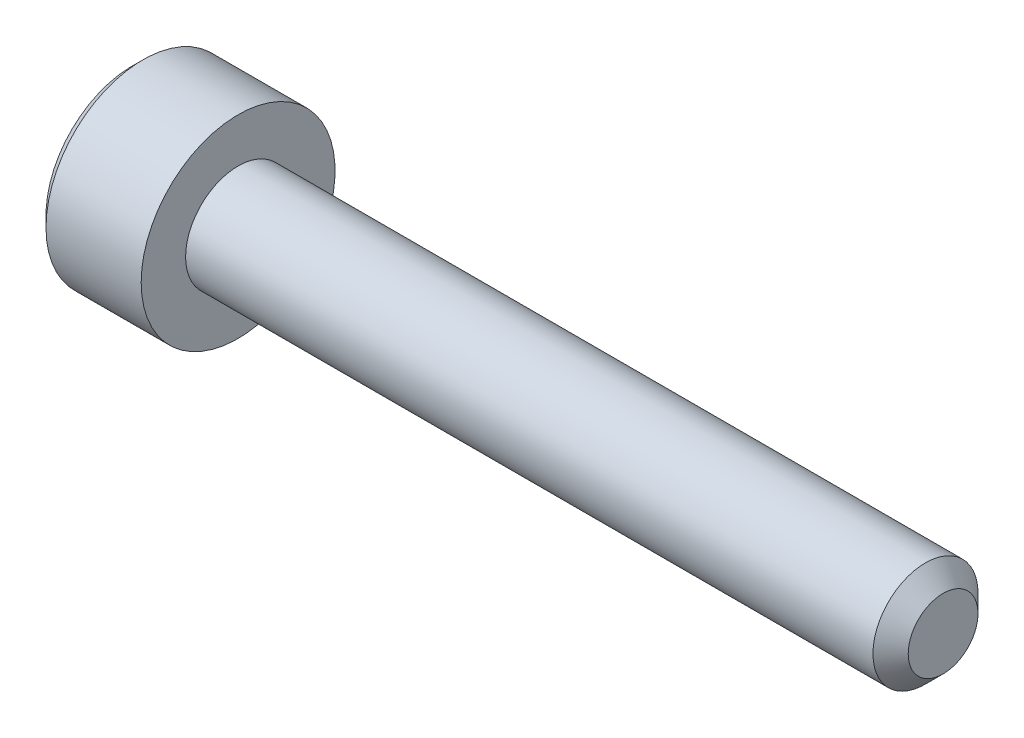
ISO-10303-21;
HEADER;
FILE_DESCRIPTION(('STEP AP214'),'2;1');
FILE_NAME('part.step','',(''),(''),'','','');
FILE_SCHEMA(('AUTOMOTIVE_DESIGN { 1 0 10303 214 1 1 1 1 }'));
ENDSEC;
DATA;
#1=APPLICATION_CONTEXT('core data for automotive mechanical design processes');
#2=APPLICATION_PROTOCOL_DEFINITION('international standard','automotive_design',2000,#1);
#3=PRODUCT_CONTEXT('',#1,'mechanical');
#4=PRODUCT('Part','Part','',(#3));
#5=PRODUCT_RELATED_PRODUCT_CATEGORY('part','',(#4));
#6=PRODUCT_DEFINITION_FORMATION('','',#4);
#7=PRODUCT_DEFINITION_CONTEXT('part definition',#1,'design');
#8=PRODUCT_DEFINITION('design','',#6,#7);
#9=PRODUCT_DEFINITION_SHAPE('','',#8);
#10=(LENGTH_UNIT() NAMED_UNIT(*) SI_UNIT(.MILLI.,.METRE.));
#11=(NAMED_UNIT(*) PLANE_ANGLE_UNIT() SI_UNIT($,.RADIAN.));
#12=(NAMED_UNIT(*) SI_UNIT($,.STERADIAN.) SOLID_ANGLE_UNIT());
#13=UNCERTAINTY_MEASURE_WITH_UNIT(LENGTH_MEASURE(1.E-05),#10,'distance_accuracy_value','');
#14=(GEOMETRIC_REPRESENTATION_CONTEXT(3) GLOBAL_UNCERTAINTY_ASSIGNED_CONTEXT((#13)) GLOBAL_UNIT_ASSIGNED_CONTEXT((#10,
#11,#12)) REPRESENTATION_CONTEXT('',''));
#15=CARTESIAN_POINT('',(0.,0.,0.));
#16=DIRECTION('',(0.,0.,1.));
#17=DIRECTION('',(1.,0.,0.));
#18=AXIS2_PLACEMENT_3D('',#15,#16,#17);
#19=CARTESIAN_POINT('',(0.,0.,0.));
#20=DIRECTION('',(1.,0.,0.));
#21=DIRECTION('',(0.,0.,-1.));
#22=AXIS2_PLACEMENT_3D('',#19,#20,#21);
#23=PLANE('',#22);
#24=DIRECTION('',(0.,0.866025403784439,0.5));
#25=VECTOR('',#24,1.);
#26=CARTESIAN_POINT('',(0.,1.4,-0.981495457622363));
#27=LINE('',#26,#25);
#28=CARTESIAN_POINT('',(0.,0.,-1.78978583448784));
#29=VERTEX_POINT('',#28);
#30=CARTESIAN_POINT('',(0.,1.55,-0.894892917243919));
#31=VERTEX_POINT('',#30);
#32=EDGE_CURVE('E154',#29,#31,#27,.T.);
#33=ORIENTED_EDGE('',*,*,#32,.T.);
#34=DIRECTION('',(0.,0.,1.));
#35=VECTOR('',#34,1.);
#36=CARTESIAN_POINT('',(0.,1.55,0.721687836487032));
#37=LINE('',#36,#35);
#38=CARTESIAN_POINT('',(0.,1.55,0.894892917243921));
#39=VERTEX_POINT('',#38);
#40=EDGE_CURVE('E164',#31,#39,#37,.T.);
#41=ORIENTED_EDGE('',*,*,#40,.T.);
#42=DIRECTION('',(0.,-0.866025403784439,0.5));
#43=VECTOR('',#42,1.);
#44=CARTESIAN_POINT('',(0.,0.150000000000001,1.7031832941094));
#45=LINE('',#44,#43);
#46=CARTESIAN_POINT('',(0.,0.,1.78978583448784));
#47=VERTEX_POINT('',#46);
#48=EDGE_CURVE('E162',#39,#47,#45,.T.);
#49=ORIENTED_EDGE('',*,*,#48,.T.);
#50=DIRECTION('',(0.,-0.866025403784439,-0.5));
#51=VECTOR('',#50,1.);
#52=CARTESIAN_POINT('',(0.,-1.4,0.981495457622366));
#53=LINE('',#52,#51);
#54=CARTESIAN_POINT('',(0.,-1.55,0.894892917243921));
#55=VERTEX_POINT('',#54);
#56=EDGE_CURVE('E160',#47,#55,#53,.T.);
#57=ORIENTED_EDGE('',*,*,#56,.T.);
#58=DIRECTION('',(0.,0.,-1.));
#59=VECTOR('',#58,1.);
#60=CARTESIAN_POINT('',(0.,-1.55,-0.721687836487031));
#61=LINE('',#60,#59);
#62=CARTESIAN_POINT('',(0.,-1.55,-0.89489291724392));
#63=VERTEX_POINT('',#62);
#64=EDGE_CURVE('E158',#55,#63,#61,.T.);
#65=ORIENTED_EDGE('',*,*,#64,.T.);
#66=DIRECTION('',(0.,0.866025403784439,-0.5));
#67=VECTOR('',#66,1.);
#68=CARTESIAN_POINT('',(0.,-0.15,-1.7031832941094));
#69=LINE('',#68,#67);
#70=EDGE_CURVE('E156',#63,#29,#69,.T.);
#71=ORIENTED_EDGE('',*,*,#70,.T.);
#72=EDGE_LOOP('',(#33,#41,#49,#57,#65,#71));
#73=FACE_BOUND('',#72,.T.);
#74=CARTESIAN_POINT('',(0.,0.,0.));
#75=DIRECTION('',(1.,0.,0.));
#76=DIRECTION('',(0.,0.,-1.));
#77=AXIS2_PLACEMENT_3D('',#74,#75,#76);
#78=CIRCLE('',#77,2.45);
#79=CARTESIAN_POINT('',(0.,0.,-2.45));
#80=VERTEX_POINT('',#79);
#81=EDGE_CURVE('E148',#80,#80,#78,.F.);
#82=ORIENTED_EDGE('',*,*,#81,.T.);
#83=EDGE_LOOP('',(#82));
#84=FACE_BOUND('',#83,.T.);
#85=ADVANCED_FACE('F33',(#73,#84),#23,.F.);
#86=CARTESIAN_POINT('',(23.,0.,0.));
#87=DIRECTION('',(-1.,0.,0.));
#88=DIRECTION('',(0.,0.,1.));
#89=AXIS2_PLACEMENT_3D('',#86,#87,#88);
#90=PLANE('',#89);
#91=CARTESIAN_POINT('',(23.,0.,0.));
#92=DIRECTION('',(-1.,0.,0.));
#93=DIRECTION('',(0.,0.,1.));
#94=AXIS2_PLACEMENT_3D('',#91,#92,#93);
#95=CIRCLE('',#94,0.989999999999991);
#96=CARTESIAN_POINT('',(23.,0.,0.989999999999991));
#97=VERTEX_POINT('',#96);
#98=EDGE_CURVE('E145',#97,#97,#95,.F.);
#99=ORIENTED_EDGE('',*,*,#98,.T.);
#100=EDGE_LOOP('',(#99));
#101=FACE_BOUND('',#100,.T.);
#102=ADVANCED_FACE('F244',(#101),#90,.F.);
#103=CARTESIAN_POINT('',(-88.7054908485857,0.,0.));
#104=DIRECTION('',(-1.,0.,0.));
#105=DIRECTION('',(0.,0.,1.));
#106=AXIS2_PLACEMENT_3D('',#103,#104,#105);
#107=CYLINDRICAL_SURFACE('',#106,1.49);
#108=CARTESIAN_POINT('',(22.5,0.,0.));
#109=DIRECTION('',(-1.,0.,0.));
#110=DIRECTION('',(0.,0.,1.));
#111=AXIS2_PLACEMENT_3D('',#108,#109,#110);
#112=CIRCLE('',#111,1.49);
#113=CARTESIAN_POINT('',(22.5,0.,1.49));
#114=VERTEX_POINT('',#113);
#115=EDGE_CURVE('E142',#114,#114,#112,.T.);
#116=ORIENTED_EDGE('',*,*,#115,.T.);
#117=EDGE_LOOP('',(#116));
#118=FACE_BOUND('',#117,.T.);
#119=CARTESIAN_POINT('',(3.,0.,0.));
#120=DIRECTION('',(-1.,0.,0.));
#121=DIRECTION('',(0.,0.,1.));
#122=AXIS2_PLACEMENT_3D('',#119,#120,#121);
#123=CIRCLE('',#122,1.49);
#124=CARTESIAN_POINT('',(3.,0.,1.49));
#125=VERTEX_POINT('',#124);
#126=EDGE_CURVE('E134',#125,#125,#123,.T.);
#127=ORIENTED_EDGE('',*,*,#126,.F.);
#128=EDGE_LOOP('',(#127));
#129=FACE_BOUND('',#128,.T.);
#130=ADVANCED_FACE('F249',(#118,#129),#107,.T.);
#131=CARTESIAN_POINT('',(3.,1.49,0.));
#132=DIRECTION('',(-1.,0.,0.));
#133=DIRECTION('',(0.,0.,1.));
#134=AXIS2_PLACEMENT_3D('',#131,#132,#133);
#135=PLANE('',#134);
#136=CARTESIAN_POINT('',(3.,0.,0.));
#137=DIRECTION('',(-1.,0.,0.));
#138=DIRECTION('',(0.,0.,1.));
#139=AXIS2_PLACEMENT_3D('',#136,#137,#138);
#140=CIRCLE('',#139,2.75);
#141=CARTESIAN_POINT('',(3.,0.,2.75));
#142=VERTEX_POINT('',#141);
#143=EDGE_CURVE('E130',#142,#142,#140,.T.);
#144=ORIENTED_EDGE('',*,*,#143,.F.);
#145=EDGE_LOOP('',(#144));
#146=FACE_BOUND('',#145,.T.);
#147=ORIENTED_EDGE('',*,*,#126,.T.);
#148=EDGE_LOOP('',(#147));
#149=FACE_BOUND('',#148,.T.);
#150=ADVANCED_FACE('F259',(#146,#149),#135,.F.);
#151=CARTESIAN_POINT('',(-88.7054908485857,0.,0.));
#152=DIRECTION('',(-1.,0.,0.));
#153=DIRECTION('',(0.,0.,1.));
#154=AXIS2_PLACEMENT_3D('',#151,#152,#153);
#155=CYLINDRICAL_SURFACE('',#154,2.75);
#156=CARTESIAN_POINT('',(0.300000000000009,0.,0.));
#157=DIRECTION('',(1.,0.,0.));
#158=DIRECTION('',(0.,0.,-1.));
#159=AXIS2_PLACEMENT_3D('',#156,#157,#158);
#160=CIRCLE('',#159,2.75);
#161=CARTESIAN_POINT('',(0.300000000000009,0.,-2.75));
#162=VERTEX_POINT('',#161);
#163=EDGE_CURVE('E151',#162,#162,#160,.T.);
#164=ORIENTED_EDGE('',*,*,#163,.T.);
#165=EDGE_LOOP('',(#164));
#166=FACE_BOUND('',#165,.T.);
#167=ORIENTED_EDGE('',*,*,#143,.T.);
#168=EDGE_LOOP('',(#167));
#169=FACE_BOUND('',#168,.T.);
#170=ADVANCED_FACE('F255',(#166,#169),#155,.T.);
#171=CARTESIAN_POINT('',(22.5,0.,0.));
#172=DIRECTION('',(-1.,0.,0.));
#173=DIRECTION('',(0.,0.,1.));
#174=AXIS2_PLACEMENT_3D('',#171,#172,#173);
#175=CONICAL_SURFACE('',#174,1.49,0.785398163397463);
#176=ORIENTED_EDGE('',*,*,#98,.F.);
#177=EDGE_LOOP('',(#176));
#178=FACE_BOUND('',#177,.T.);
#179=ORIENTED_EDGE('',*,*,#115,.F.);
#180=EDGE_LOOP('',(#179));
#181=FACE_BOUND('',#180,.T.);
#182=ADVANCED_FACE('F258',(#178,#181),#175,.T.);
#183=CARTESIAN_POINT('',(0.,0.,0.));
#184=DIRECTION('',(1.,0.,0.));
#185=DIRECTION('',(0.,0.,-1.));
#186=AXIS2_PLACEMENT_3D('',#183,#184,#185);
#187=CONICAL_SURFACE('',#186,2.45,0.785398163397438);
#188=ORIENTED_EDGE('',*,*,#163,.F.);
#189=EDGE_LOOP('',(#188));
#190=FACE_BOUND('',#189,.T.);
#191=ORIENTED_EDGE('',*,*,#81,.F.);
#192=EDGE_LOOP('',(#191));
#193=FACE_BOUND('',#192,.T.);
#194=ADVANCED_FACE('F269',(#190,#193),#187,.T.);
#195=CARTESIAN_POINT('',(2.5,1.25,0.721687836487032));
#196=DIRECTION('',(0.,-0.5,-0.866025403784438));
#197=DIRECTION('',(0.,0.866025403784439,-0.5));
#198=AXIS2_PLACEMENT_3D('',#195,#196,#197);
#199=PLANE('',#198);
#200=DIRECTION('',(-1.,0.,0.));
#201=VECTOR('',#200,1.);
#202=CARTESIAN_POINT('',(2.5,0.,1.44337567297407));
#203=LINE('',#202,#201);
#204=CARTESIAN_POINT('',(2.5,0.,1.44337567297407));
#205=VERTEX_POINT('',#204);
#206=CARTESIAN_POINT('',(0.299999999999998,0.,1.44337567297407));
#207=VERTEX_POINT('',#206);
#208=EDGE_CURVE('E122',#205,#207,#203,.T.);
#209=ORIENTED_EDGE('',*,*,#208,.T.);
#210=DIRECTION('',(0.,0.866025403784439,-0.5));
#211=VECTOR('',#210,1.);
#212=CARTESIAN_POINT('',(0.299999999999998,1.25,0.721687836487032));
#213=LINE('',#212,#211);
#214=CARTESIAN_POINT('',(0.299999999999998,1.25,0.721687836487032));
#215=VERTEX_POINT('',#214);
#216=EDGE_CURVE('E170',#207,#215,#213,.T.);
#217=ORIENTED_EDGE('',*,*,#216,.T.);
#218=DIRECTION('',(-1.,0.,0.));
#219=VECTOR('',#218,1.);
#220=CARTESIAN_POINT('',(2.5,1.25,0.721687836487032));
#221=LINE('',#220,#219);
#222=CARTESIAN_POINT('',(2.5,1.25,0.721687836487032));
#223=VERTEX_POINT('',#222);
#224=EDGE_CURVE('E125',#223,#215,#221,.T.);
#225=ORIENTED_EDGE('',*,*,#224,.F.);
#226=DIRECTION('',(0.,-0.866025403784439,0.5));
#227=VECTOR('',#226,1.);
#228=CARTESIAN_POINT('',(2.5,1.25,0.721687836487032));
#229=LINE('',#228,#227);
#230=EDGE_CURVE('E110',#223,#205,#229,.T.);
#231=ORIENTED_EDGE('',*,*,#230,.T.);
#232=EDGE_LOOP('',(#209,#217,#225,#231));
#233=FACE_BOUND('',#232,.T.);
#234=ADVANCED_FACE('F121',(#233),#199,.T.);
#235=CARTESIAN_POINT('',(2.5,0.,1.44337567297407));
#236=DIRECTION('',(0.,0.5,-0.866025403784438));
#237=DIRECTION('',(0.,0.866025403784439,0.5));
#238=AXIS2_PLACEMENT_3D('',#235,#236,#237);
#239=PLANE('',#238);
#240=DIRECTION('',(-1.,0.,0.));
#241=VECTOR('',#240,1.);
#242=CARTESIAN_POINT('',(2.5,-1.25,0.721687836487033));
#243=LINE('',#242,#241);
#244=CARTESIAN_POINT('',(2.5,-1.25,0.721687836487033));
#245=VERTEX_POINT('',#244);
#246=CARTESIAN_POINT('',(0.299999999999998,-1.25,0.721687836487033));
#247=VERTEX_POINT('',#246);
#248=EDGE_CURVE('E131',#245,#247,#243,.T.);
#249=ORIENTED_EDGE('',*,*,#248,.T.);
#250=DIRECTION('',(0.,0.866025403784439,0.5));
#251=VECTOR('',#250,1.);
#252=CARTESIAN_POINT('',(0.299999999999998,0.,1.44337567297407));
#253=LINE('',#252,#251);
#254=EDGE_CURVE('E129',#247,#207,#253,.T.);
#255=ORIENTED_EDGE('',*,*,#254,.T.);
#256=ORIENTED_EDGE('',*,*,#208,.F.);
#257=DIRECTION('',(0.,-0.866025403784439,-0.5));
#258=VECTOR('',#257,1.);
#259=CARTESIAN_POINT('',(2.5,0.,1.44337567297407));
#260=LINE('',#259,#258);
#261=EDGE_CURVE('E106',#205,#245,#260,.T.);
#262=ORIENTED_EDGE('',*,*,#261,.T.);
#263=EDGE_LOOP('',(#249,#255,#256,#262));
#264=FACE_BOUND('',#263,.T.);
#265=ADVANCED_FACE('F127',(#264),#239,.T.);
#266=CARTESIAN_POINT('',(2.5,-1.25,0.721687836487033));
#267=DIRECTION('',(0.,1.,0.));
#268=DIRECTION('',(0.,0.,1.));
#269=AXIS2_PLACEMENT_3D('',#266,#267,#268);
#270=PLANE('',#269);
#271=DIRECTION('',(-1.,0.,0.));
#272=VECTOR('',#271,1.);
#273=CARTESIAN_POINT('',(2.5,-1.25,-0.721687836487031));
#274=LINE('',#273,#272);
#275=CARTESIAN_POINT('',(2.5,-1.25,-0.721687836487031));
#276=VERTEX_POINT('',#275);
#277=CARTESIAN_POINT('',(0.299999999999998,-1.25,-0.721687836487031));
#278=VERTEX_POINT('',#277);
#279=EDGE_CURVE('E136',#276,#278,#274,.T.);
#280=ORIENTED_EDGE('',*,*,#279,.T.);
#281=DIRECTION('',(0.,0.,1.));
#282=VECTOR('',#281,1.);
#283=CARTESIAN_POINT('',(0.299999999999998,-1.25,0.721687836487033));
#284=LINE('',#283,#282);
#285=EDGE_CURVE('E173',#278,#247,#284,.T.);
#286=ORIENTED_EDGE('',*,*,#285,.T.);
#287=ORIENTED_EDGE('',*,*,#248,.F.);
#288=DIRECTION('',(0.,0.,-1.));
#289=VECTOR('',#288,1.);
#290=CARTESIAN_POINT('',(2.5,-1.25,0.721687836487033));
#291=LINE('',#290,#289);
#292=EDGE_CURVE('E112',#245,#276,#291,.T.);
#293=ORIENTED_EDGE('',*,*,#292,.T.);
#294=EDGE_LOOP('',(#280,#286,#287,#293));
#295=FACE_BOUND('',#294,.T.);
#296=ADVANCED_FACE('F200',(#295),#270,.T.);
#297=CARTESIAN_POINT('',(2.5,-1.25,-0.721687836487031));
#298=DIRECTION('',(0.,0.5,0.866025403784439));
#299=DIRECTION('',(0.,-0.866025403784439,0.5));
#300=AXIS2_PLACEMENT_3D('',#297,#298,#299);
#301=PLANE('',#300);
#302=DIRECTION('',(-1.,0.,0.));
#303=VECTOR('',#302,1.);
#304=CARTESIAN_POINT('',(2.5,0.,-1.44337567297406));
#305=LINE('',#304,#303);
#306=CARTESIAN_POINT('',(2.5,0.,-1.44337567297406));
#307=VERTEX_POINT('',#306);
#308=CARTESIAN_POINT('',(0.299999999999998,0.,-1.44337567297406));
#309=VERTEX_POINT('',#308);
#310=EDGE_CURVE('E201',#307,#309,#305,.T.);
#311=ORIENTED_EDGE('',*,*,#310,.T.);
#312=DIRECTION('',(0.,-0.866025403784439,0.5));
#313=VECTOR('',#312,1.);
#314=CARTESIAN_POINT('',(0.299999999999998,-1.25,-0.721687836487031));
#315=LINE('',#314,#313);
#316=EDGE_CURVE('E42',#309,#278,#315,.T.);
#317=ORIENTED_EDGE('',*,*,#316,.T.);
#318=ORIENTED_EDGE('',*,*,#279,.F.);
#319=DIRECTION('',(0.,0.866025403784439,-0.499999999999999));
#320=VECTOR('',#319,1.);
#321=CARTESIAN_POINT('',(2.5,-1.25,-0.721687836487031));
#322=LINE('',#321,#320);
#323=EDGE_CURVE('E211',#276,#307,#322,.T.);
#324=ORIENTED_EDGE('',*,*,#323,.T.);
#325=EDGE_LOOP('',(#311,#317,#318,#324));
#326=FACE_BOUND('',#325,.T.);
#327=ADVANCED_FACE('F213',(#326),#301,.T.);
#328=CARTESIAN_POINT('',(2.5,0.,-1.44337567297406));
#329=DIRECTION('',(0.,-0.5,0.866025403784439));
#330=DIRECTION('',(0.,-0.866025403784439,-0.5));
#331=AXIS2_PLACEMENT_3D('',#328,#329,#330);
#332=PLANE('',#331);
#333=DIRECTION('',(-1.,0.,0.));
#334=VECTOR('',#333,1.);
#335=CARTESIAN_POINT('',(2.5,1.25,-0.72168783648703));
#336=LINE('',#335,#334);
#337=CARTESIAN_POINT('',(2.5,1.25,-0.72168783648703));
#338=VERTEX_POINT('',#337);
#339=CARTESIAN_POINT('',(0.299999999999998,1.25,-0.72168783648703));
#340=VERTEX_POINT('',#339);
#341=EDGE_CURVE('E202',#338,#340,#336,.T.);
#342=ORIENTED_EDGE('',*,*,#341,.T.);
#343=DIRECTION('',(0.,-0.866025403784439,-0.5));
#344=VECTOR('',#343,1.);
#345=CARTESIAN_POINT('',(0.299999999999998,0.,-1.44337567297406));
#346=LINE('',#345,#344);
#347=EDGE_CURVE('E11',#340,#309,#346,.T.);
#348=ORIENTED_EDGE('',*,*,#347,.T.);
#349=ORIENTED_EDGE('',*,*,#310,.F.);
#350=DIRECTION('',(0.,0.866025403784438,0.5));
#351=VECTOR('',#350,1.);
#352=CARTESIAN_POINT('',(2.5,0.,-1.44337567297406));
#353=LINE('',#352,#351);
#354=EDGE_CURVE('E209',#307,#338,#353,.T.);
#355=ORIENTED_EDGE('',*,*,#354,.T.);
#356=EDGE_LOOP('',(#342,#348,#349,#355));
#357=FACE_BOUND('',#356,.T.);
#358=ADVANCED_FACE('F215',(#357),#332,.T.);
#359=CARTESIAN_POINT('',(2.5,1.25,-0.72168783648703));
#360=DIRECTION('',(0.,-1.,0.));
#361=DIRECTION('',(0.,0.,-1.));
#362=AXIS2_PLACEMENT_3D('',#359,#360,#361);
#363=PLANE('',#362);
#364=ORIENTED_EDGE('',*,*,#224,.T.);
#365=DIRECTION('',(0.,0.,-1.));
#366=VECTOR('',#365,1.);
#367=CARTESIAN_POINT('',(0.299999999999998,1.25,-0.72168783648703));
#368=LINE('',#367,#366);
#369=EDGE_CURVE('E167',#215,#340,#368,.T.);
#370=ORIENTED_EDGE('',*,*,#369,.T.);
#371=ORIENTED_EDGE('',*,*,#341,.F.);
#372=DIRECTION('',(0.,0.,1.));
#373=VECTOR('',#372,1.);
#374=CARTESIAN_POINT('',(2.5,1.25,-0.72168783648703));
#375=LINE('',#374,#373);
#376=EDGE_CURVE('E207',#338,#223,#375,.T.);
#377=ORIENTED_EDGE('',*,*,#376,.T.);
#378=EDGE_LOOP('',(#364,#370,#371,#377));
#379=FACE_BOUND('',#378,.T.);
#380=ADVANCED_FACE('F218',(#379),#363,.T.);
#381=CARTESIAN_POINT('',(2.5,0.,0.));
#382=DIRECTION('',(1.,0.,0.));
#383=DIRECTION('',(0.,0.,-1.));
#384=AXIS2_PLACEMENT_3D('',#381,#382,#383);
#385=PLANE('',#384);
#386=ORIENTED_EDGE('',*,*,#230,.F.);
#387=ORIENTED_EDGE('',*,*,#376,.F.);
#388=ORIENTED_EDGE('',*,*,#354,.F.);
#389=ORIENTED_EDGE('',*,*,#323,.F.);
#390=ORIENTED_EDGE('',*,*,#292,.F.);
#391=ORIENTED_EDGE('',*,*,#261,.F.);
#392=EDGE_LOOP('',(#386,#387,#388,#389,#390,#391));
#393=FACE_BOUND('',#392,.T.);
#394=ADVANCED_FACE('F108',(#393),#385,.F.);
#395=CARTESIAN_POINT('',(0.,-1.55,0.));
#396=DIRECTION('',(-0.707106781186552,0.707106781186543,0.));
#397=DIRECTION('',(0.,0.,1.));
#398=AXIS2_PLACEMENT_3D('',#395,#396,#397);
#399=PLANE('',#398);
#400=DIRECTION('',(0.654653670707973,0.654653670707981,-0.377964473009229));
#401=VECTOR('',#400,1.);
#402=CARTESIAN_POINT('',(0.221428571428571,-1.32857142857143,0.76705107192336));
#403=LINE('',#402,#401);
#404=EDGE_CURVE('E185',#247,#55,#403,.F.);
#405=ORIENTED_EDGE('',*,*,#404,.F.);
#406=ORIENTED_EDGE('',*,*,#285,.F.);
#407=DIRECTION('',(0.654653670707973,0.654653670707981,0.377964473009229));
#408=VECTOR('',#407,1.);
#409=CARTESIAN_POINT('',(0.221428571428571,-1.32857142857143,-0.767051071923359));
#410=LINE('',#409,#408);
#411=EDGE_CURVE('E37',#63,#278,#410,.T.);
#412=ORIENTED_EDGE('',*,*,#411,.F.);
#413=ORIENTED_EDGE('',*,*,#64,.F.);
#414=EDGE_LOOP('',(#405,#406,#412,#413));
#415=FACE_BOUND('',#414,.T.);
#416=ADVANCED_FACE('F35',(#415),#399,.T.);
#417=CARTESIAN_POINT('',(0.,-0.775,-1.34233937586588));
#418=DIRECTION('',(-0.707106781186552,0.353553390593271,0.612372435695791));
#419=DIRECTION('',(0.,-0.866025403784439,0.5));
#420=AXIS2_PLACEMENT_3D('',#417,#418,#419);
#421=PLANE('',#420);
#422=ORIENTED_EDGE('',*,*,#411,.T.);
#423=ORIENTED_EDGE('',*,*,#316,.F.);
#424=DIRECTION('',(0.654653670707973,0.,0.755928946018458));
#425=VECTOR('',#424,1.);
#426=CARTESIAN_POINT('',(0.221428571428571,0.,-1.53410214384672));
#427=LINE('',#426,#425);
#428=EDGE_CURVE('E183',#29,#309,#427,.T.);
#429=ORIENTED_EDGE('',*,*,#428,.F.);
#430=ORIENTED_EDGE('',*,*,#70,.F.);
#431=EDGE_LOOP('',(#422,#423,#429,#430));
#432=FACE_BOUND('',#431,.T.);
#433=ADVANCED_FACE('F194',(#432),#421,.T.);
#434=CARTESIAN_POINT('',(0.,-0.775000000000002,1.34233937586588));
#435=DIRECTION('',(-0.707106781186552,0.353553390593272,-0.612372435695791));
#436=DIRECTION('',(0.,0.866025403784439,0.5));
#437=AXIS2_PLACEMENT_3D('',#434,#435,#436);
#438=PLANE('',#437);
#439=ORIENTED_EDGE('',*,*,#404,.T.);
#440=ORIENTED_EDGE('',*,*,#56,.F.);
#441=DIRECTION('',(0.654653670707973,0.,-0.755928946018458));
#442=VECTOR('',#441,1.);
#443=CARTESIAN_POINT('',(0.221428571428572,0.,1.53410214384672));
#444=LINE('',#443,#442);
#445=EDGE_CURVE('E180',#207,#47,#444,.F.);
#446=ORIENTED_EDGE('',*,*,#445,.F.);
#447=ORIENTED_EDGE('',*,*,#254,.F.);
#448=EDGE_LOOP('',(#439,#440,#446,#447));
#449=FACE_BOUND('',#448,.T.);
#450=ADVANCED_FACE('F235',(#449),#438,.T.);
#451=CARTESIAN_POINT('',(0.,0.775000000000001,-1.34233937586588));
#452=DIRECTION('',(-0.707106781186552,-0.353553390593272,0.612372435695791));
#453=DIRECTION('',(0.,-0.866025403784439,-0.5));
#454=AXIS2_PLACEMENT_3D('',#451,#452,#453);
#455=PLANE('',#454);
#456=ORIENTED_EDGE('',*,*,#428,.T.);
#457=ORIENTED_EDGE('',*,*,#347,.F.);
#458=DIRECTION('',(-0.654653670707973,0.654653670707981,-0.377964473009229));
#459=VECTOR('',#458,1.);
#460=CARTESIAN_POINT('',(0.221428571428571,1.32857142857143,-0.767051071923358));
#461=LINE('',#460,#459);
#462=EDGE_CURVE('E178',#31,#340,#461,.F.);
#463=ORIENTED_EDGE('',*,*,#462,.F.);
#464=ORIENTED_EDGE('',*,*,#32,.F.);
#465=EDGE_LOOP('',(#456,#457,#463,#464));
#466=FACE_BOUND('',#465,.T.);
#467=ADVANCED_FACE('F233',(#466),#455,.T.);
#468=CARTESIAN_POINT('',(0.,0.775000000000001,1.34233937586588));
#469=DIRECTION('',(-0.707106781186552,-0.353553390593272,-0.612372435695791));
#470=DIRECTION('',(0.,0.866025403784439,-0.5));
#471=AXIS2_PLACEMENT_3D('',#468,#469,#470);
#472=PLANE('',#471);
#473=ORIENTED_EDGE('',*,*,#445,.T.);
#474=ORIENTED_EDGE('',*,*,#48,.F.);
#475=DIRECTION('',(0.654653670707973,-0.654653670707981,-0.377964473009229));
#476=VECTOR('',#475,1.);
#477=CARTESIAN_POINT('',(0.221428571428571,1.32857142857143,0.767051071923359));
#478=LINE('',#477,#476);
#479=EDGE_CURVE('E176',#215,#39,#478,.F.);
#480=ORIENTED_EDGE('',*,*,#479,.F.);
#481=ORIENTED_EDGE('',*,*,#216,.F.);
#482=EDGE_LOOP('',(#473,#474,#480,#481));
#483=FACE_BOUND('',#482,.T.);
#484=ADVANCED_FACE('F228',(#483),#472,.T.);
#485=CARTESIAN_POINT('',(0.,1.55,0.));
#486=DIRECTION('',(-0.707106781186552,-0.707106781186543,0.));
#487=DIRECTION('',(0.,0.,-1.));
#488=AXIS2_PLACEMENT_3D('',#485,#486,#487);
#489=PLANE('',#488);
#490=ORIENTED_EDGE('',*,*,#462,.T.);
#491=ORIENTED_EDGE('',*,*,#369,.F.);
#492=ORIENTED_EDGE('',*,*,#479,.T.);
#493=ORIENTED_EDGE('',*,*,#40,.F.);
#494=EDGE_LOOP('',(#490,#491,#492,#493));
#495=FACE_BOUND('',#494,.T.);
#496=ADVANCED_FACE('F222',(#495),#489,.T.);
#497=CLOSED_SHELL('',(#85,#102,#130,#150,#170,#182,#194,#234,#265,#296,#327,#358,#380,#394,#416,
#433,#450,#467,#484,#496));
#498=MANIFOLD_SOLID_BREP('B2',#497);
#499=ADVANCED_BREP_SHAPE_REPRESENTATION('',(#18,#498),#14);
#500=SHAPE_DEFINITION_REPRESENTATION(#9,#499);
ENDSEC;
END-ISO-10303-21;
